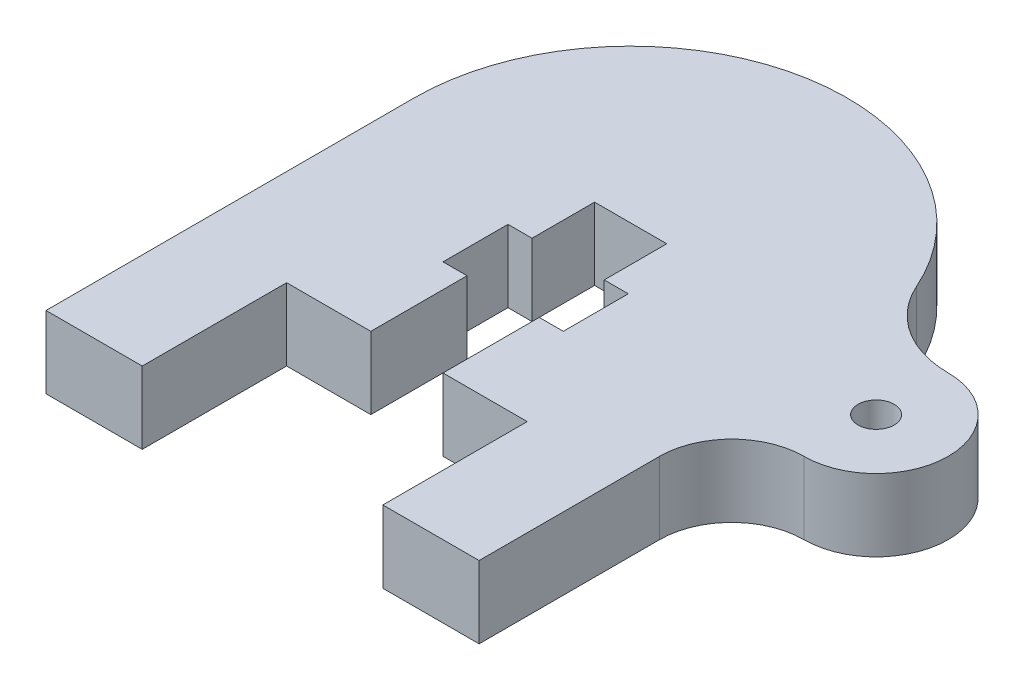
ISO-10303-21;
HEADER;
FILE_DESCRIPTION(('STEP AP214'),'2;1');
FILE_NAME('part.step','',(''),(''),'','','');
FILE_SCHEMA(('AUTOMOTIVE_DESIGN { 1 0 10303 214 1 1 1 1 }'));
ENDSEC;
DATA;
#1=APPLICATION_CONTEXT('core data for automotive mechanical design processes');
#2=APPLICATION_PROTOCOL_DEFINITION('international standard','automotive_design',2000,#1);
#3=PRODUCT_CONTEXT('',#1,'mechanical');
#4=PRODUCT('Part','Part','',(#3));
#5=PRODUCT_RELATED_PRODUCT_CATEGORY('part','',(#4));
#6=PRODUCT_DEFINITION_FORMATION('','',#4);
#7=PRODUCT_DEFINITION_CONTEXT('part definition',#1,'design');
#8=PRODUCT_DEFINITION('design','',#6,#7);
#9=PRODUCT_DEFINITION_SHAPE('','',#8);
#10=(LENGTH_UNIT() NAMED_UNIT(*) SI_UNIT(.MILLI.,.METRE.));
#11=(NAMED_UNIT(*) PLANE_ANGLE_UNIT() SI_UNIT($,.RADIAN.));
#12=(NAMED_UNIT(*) SI_UNIT($,.STERADIAN.) SOLID_ANGLE_UNIT());
#13=UNCERTAINTY_MEASURE_WITH_UNIT(LENGTH_MEASURE(1.E-05),#10,'distance_accuracy_value','');
#14=(GEOMETRIC_REPRESENTATION_CONTEXT(3) GLOBAL_UNCERTAINTY_ASSIGNED_CONTEXT((#13)) GLOBAL_UNIT_ASSIGNED_CONTEXT((#10,
#11,#12)) REPRESENTATION_CONTEXT('',''));
#15=CARTESIAN_POINT('',(0.,0.,0.));
#16=DIRECTION('',(0.,0.,1.));
#17=DIRECTION('',(1.,0.,0.));
#18=AXIS2_PLACEMENT_3D('',#15,#16,#17);
#19=CARTESIAN_POINT('',(-32.3037732077525,3.,-8.18438991730198));
#20=DIRECTION('',(0.,-1.,0.));
#21=DIRECTION('',(0.,0.,-1.));
#22=AXIS2_PLACEMENT_3D('',#19,#20,#21);
#23=PLANE('',#22);
#24=CARTESIAN_POINT('',(-32.3037732077525,3.,-8.18438991730198));
#25=DIRECTION('',(0.,1.,0.));
#26=DIRECTION('',(0.,0.,-1.));
#27=AXIS2_PLACEMENT_3D('',#24,#25,#26);
#28=CIRCLE('',#27,9.00000000000001);
#29=CARTESIAN_POINT('',(-24.0788171444836,3.,-11.8381684761772));
#30=VERTEX_POINT('',#29);
#31=CARTESIAN_POINT('',(-41.3037732077525,3.,-8.18438991730198));
#32=VERTEX_POINT('',#31);
#33=EDGE_CURVE('E272',#30,#32,#28,.T.);
#34=ORIENTED_EDGE('',*,*,#33,.T.);
#35=DIRECTION('',(0.,0.,1.));
#36=VECTOR('',#35,1.);
#37=CARTESIAN_POINT('',(-41.3037732077525,3.,-8.18438991730198));
#38=LINE('',#37,#36);
#39=CARTESIAN_POINT('',(-41.3037732077525,3.,7.11561008269802));
#40=VERTEX_POINT('',#39);
#41=EDGE_CURVE('E148',#32,#40,#38,.T.);
#42=ORIENTED_EDGE('',*,*,#41,.T.);
#43=DIRECTION('',(1.,0.,0.));
#44=VECTOR('',#43,1.);
#45=CARTESIAN_POINT('',(-41.3037732077525,3.,7.11561008269802));
#46=LINE('',#45,#44);
#47=CARTESIAN_POINT('',(-37.3037732077525,3.,7.11561008269802));
#48=VERTEX_POINT('',#47);
#49=EDGE_CURVE('E334',#40,#48,#46,.T.);
#50=ORIENTED_EDGE('',*,*,#49,.T.);
#51=DIRECTION('',(0.,0.,-1.));
#52=VECTOR('',#51,1.);
#53=CARTESIAN_POINT('',(-37.3037732077525,3.,7.11561008269802));
#54=LINE('',#53,#52);
#55=CARTESIAN_POINT('',(-37.3037732077525,3.,1.11561008269802));
#56=VERTEX_POINT('',#55);
#57=EDGE_CURVE('E355',#48,#56,#54,.T.);
#58=ORIENTED_EDGE('',*,*,#57,.T.);
#59=DIRECTION('',(1.,0.,0.));
#60=VECTOR('',#59,1.);
#61=CARTESIAN_POINT('',(-37.3037732077525,3.,1.11561008269802));
#62=LINE('',#61,#60);
#63=CARTESIAN_POINT('',(-33.8037732077525,3.,1.11561008269802));
#64=VERTEX_POINT('',#63);
#65=EDGE_CURVE('E349',#56,#64,#62,.T.);
#66=ORIENTED_EDGE('',*,*,#65,.T.);
#67=DIRECTION('',(0.,0.,-1.));
#68=VECTOR('',#67,1.);
#69=CARTESIAN_POINT('',(-33.8037732077525,3.,1.11561008269802));
#70=LINE('',#69,#68);
#71=CARTESIAN_POINT('',(-33.8037732077525,3.,-2.88438991730198));
#72=VERTEX_POINT('',#71);
#73=EDGE_CURVE('E351',#64,#72,#70,.T.);
#74=ORIENTED_EDGE('',*,*,#73,.T.);
#75=DIRECTION('',(-1.,0.,0.));
#76=VECTOR('',#75,1.);
#77=CARTESIAN_POINT('',(-33.8037732077525,3.,-2.88438991730198));
#78=LINE('',#77,#76);
#79=CARTESIAN_POINT('',(-34.8037732077525,3.,-2.88438991730198));
#80=VERTEX_POINT('',#79);
#81=EDGE_CURVE('E353',#72,#80,#78,.T.);
#82=ORIENTED_EDGE('',*,*,#81,.T.);
#83=DIRECTION('',(0.,0.,-1.));
#84=VECTOR('',#83,1.);
#85=CARTESIAN_POINT('',(-34.8037732077525,3.,-2.88438991730198));
#86=LINE('',#85,#84);
#87=CARTESIAN_POINT('',(-34.8037732077525,3.,-5.58438991730198));
#88=VERTEX_POINT('',#87);
#89=EDGE_CURVE('E358',#80,#88,#86,.T.);
#90=ORIENTED_EDGE('',*,*,#89,.T.);
#91=DIRECTION('',(1.,0.,0.));
#92=VECTOR('',#91,1.);
#93=CARTESIAN_POINT('',(-34.8037732077525,3.,-5.58438991730198));
#94=LINE('',#93,#92);
#95=CARTESIAN_POINT('',(-33.8037732077525,3.,-5.58438991730198));
#96=VERTEX_POINT('',#95);
#97=EDGE_CURVE('E362',#88,#96,#94,.T.);
#98=ORIENTED_EDGE('',*,*,#97,.T.);
#99=DIRECTION('',(0.,0.,-1.));
#100=VECTOR('',#99,1.);
#101=CARTESIAN_POINT('',(-33.8037732077525,3.,-5.58438991730198));
#102=LINE('',#101,#100);
#103=CARTESIAN_POINT('',(-33.8037732077525,3.,-8.18438991730198));
#104=VERTEX_POINT('',#103);
#105=EDGE_CURVE('E365',#96,#104,#102,.T.);
#106=ORIENTED_EDGE('',*,*,#105,.T.);
#107=DIRECTION('',(1.,0.,0.));
#108=VECTOR('',#107,1.);
#109=CARTESIAN_POINT('',(-33.8037732077525,3.,-8.18438991730198));
#110=LINE('',#109,#108);
#111=CARTESIAN_POINT('',(-30.8037732077525,3.,-8.18438991730198));
#112=VERTEX_POINT('',#111);
#113=EDGE_CURVE('E368',#104,#112,#110,.T.);
#114=ORIENTED_EDGE('',*,*,#113,.T.);
#115=DIRECTION('',(0.,0.,1.));
#116=VECTOR('',#115,1.);
#117=CARTESIAN_POINT('',(-30.8037732077525,3.,-5.58438991730198));
#118=LINE('',#117,#116);
#119=CARTESIAN_POINT('',(-30.8037732077525,3.,-5.58438991730198));
#120=VERTEX_POINT('',#119);
#121=EDGE_CURVE('E366',#112,#120,#118,.T.);
#122=ORIENTED_EDGE('',*,*,#121,.T.);
#123=DIRECTION('',(1.,0.,0.));
#124=VECTOR('',#123,1.);
#125=CARTESIAN_POINT('',(-29.8037732077525,3.,-5.58438991730198));
#126=LINE('',#125,#124);
#127=CARTESIAN_POINT('',(-29.8037732077525,3.,-5.58438991730198));
#128=VERTEX_POINT('',#127);
#129=EDGE_CURVE('E367',#120,#128,#126,.T.);
#130=ORIENTED_EDGE('',*,*,#129,.T.);
#131=DIRECTION('',(0.,0.,1.));
#132=VECTOR('',#131,1.);
#133=CARTESIAN_POINT('',(-29.8037732077525,3.,-2.88438991730198));
#134=LINE('',#133,#132);
#135=CARTESIAN_POINT('',(-29.8037732077525,3.,-2.88438991730198));
#136=VERTEX_POINT('',#135);
#137=EDGE_CURVE('E375',#128,#136,#134,.T.);
#138=ORIENTED_EDGE('',*,*,#137,.T.);
#139=DIRECTION('',(-1.,0.,0.));
#140=VECTOR('',#139,1.);
#141=CARTESIAN_POINT('',(-30.8037732077525,3.,-2.88438991730198));
#142=LINE('',#141,#140);
#143=CARTESIAN_POINT('',(-30.8037732077525,3.,-2.88438991730198));
#144=VERTEX_POINT('',#143);
#145=EDGE_CURVE('E372',#136,#144,#142,.T.);
#146=ORIENTED_EDGE('',*,*,#145,.T.);
#147=DIRECTION('',(0.,0.,1.));
#148=VECTOR('',#147,1.);
#149=CARTESIAN_POINT('',(-30.8037732077525,3.,1.11561008269802));
#150=LINE('',#149,#148);
#151=CARTESIAN_POINT('',(-30.8037732077525,3.,1.11561008269802));
#152=VERTEX_POINT('',#151);
#153=EDGE_CURVE('E376',#144,#152,#150,.T.);
#154=ORIENTED_EDGE('',*,*,#153,.T.);
#155=DIRECTION('',(1.,0.,0.));
#156=VECTOR('',#155,1.);
#157=CARTESIAN_POINT('',(-27.3037732077525,3.,1.11561008269802));
#158=LINE('',#157,#156);
#159=CARTESIAN_POINT('',(-27.3037732077525,3.,1.11561008269802));
#160=VERTEX_POINT('',#159);
#161=EDGE_CURVE('E378',#152,#160,#158,.T.);
#162=ORIENTED_EDGE('',*,*,#161,.T.);
#163=DIRECTION('',(0.,0.,1.));
#164=VECTOR('',#163,1.);
#165=CARTESIAN_POINT('',(-27.3037732077525,3.,7.11561008269802));
#166=LINE('',#165,#164);
#167=CARTESIAN_POINT('',(-27.3037732077525,3.,7.11561008269802));
#168=VERTEX_POINT('',#167);
#169=EDGE_CURVE('E379',#160,#168,#166,.T.);
#170=ORIENTED_EDGE('',*,*,#169,.T.);
#171=DIRECTION('',(1.,0.,0.));
#172=VECTOR('',#171,1.);
#173=CARTESIAN_POINT('',(-23.3037732077525,3.,7.11561008269802));
#174=LINE('',#173,#172);
#175=CARTESIAN_POINT('',(-23.3037732077525,3.,7.11561008269802));
#176=VERTEX_POINT('',#175);
#177=EDGE_CURVE('E385',#168,#176,#174,.T.);
#178=ORIENTED_EDGE('',*,*,#177,.T.);
#179=DIRECTION('',(0.,0.,-1.));
#180=VECTOR('',#179,1.);
#181=CARTESIAN_POINT('',(-23.3037732077525,3.,7.11561008269802));
#182=LINE('',#181,#180);
#183=CARTESIAN_POINT('',(-23.3037732077525,3.,-0.384389917301983));
#184=VERTEX_POINT('',#183);
#185=EDGE_CURVE('E209',#176,#184,#182,.T.);
#186=ORIENTED_EDGE('',*,*,#185,.T.);
#187=CARTESIAN_POINT('',(-20.3037732077525,3.,-0.384389917301983));
#188=DIRECTION('',(0.,-1.,0.));
#189=DIRECTION('',(0.,0.,-1.));
#190=AXIS2_PLACEMENT_3D('',#187,#188,#189);
#191=CIRCLE('',#190,3.);
#192=CARTESIAN_POINT('',(-20.3037732077525,3.,-3.38438991730198));
#193=VERTEX_POINT('',#192);
#194=EDGE_CURVE('E204',#184,#193,#191,.T.);
#195=ORIENTED_EDGE('',*,*,#194,.T.);
#196=CARTESIAN_POINT('',(-20.3037732077525,3.,-6.38438991730198));
#197=DIRECTION('',(0.,1.,0.));
#198=DIRECTION('',(0.,0.,1.));
#199=AXIS2_PLACEMENT_3D('',#196,#197,#198);
#200=CIRCLE('',#199,3.);
#201=CARTESIAN_POINT('',(-20.3037732077525,3.,-9.38438991730198));
#202=VERTEX_POINT('',#201);
#203=EDGE_CURVE('E208',#193,#202,#200,.T.);
#204=ORIENTED_EDGE('',*,*,#203,.T.);
#205=CARTESIAN_POINT('',(-20.3037732077525,3.,-13.5151591480713));
#206=DIRECTION('',(0.,-1.,0.));
#207=DIRECTION('',(0.,0.,-1.));
#208=AXIS2_PLACEMENT_3D('',#205,#206,#207);
#209=CIRCLE('',#208,4.13076923076927);
#210=EDGE_CURVE('E59',#202,#30,#209,.T.);
#211=ORIENTED_EDGE('',*,*,#210,.T.);
#212=EDGE_LOOP('',(#34,#42,#50,#58,#66,#74,#82,#90,#98,#106,#114,#122,#130,#138,#146,#154,#162,
#170,#178,#186,#195,#204,#211));
#213=FACE_BOUND('',#212,.T.);
#214=CARTESIAN_POINT('',(-20.3037732077525,3.,-6.38438991730198));
#215=DIRECTION('',(0.,1.,0.));
#216=DIRECTION('',(0.,0.,1.));
#217=AXIS2_PLACEMENT_3D('',#214,#215,#216);
#218=CIRCLE('',#217,0.750000000000002);
#219=CARTESIAN_POINT('',(-20.3037732077525,3.,-5.63438991730198));
#220=VERTEX_POINT('',#219);
#221=EDGE_CURVE('E234',#220,#220,#218,.T.);
#222=ORIENTED_EDGE('',*,*,#221,.F.);
#223=EDGE_LOOP('',(#222));
#224=FACE_BOUND('',#223,.T.);
#225=ADVANCED_FACE('F41',(#213,#224),#23,.F.);
#226=CARTESIAN_POINT('',(-32.3037732077525,0.,-8.18438991730198));
#227=DIRECTION('',(0.,-1.,0.));
#228=DIRECTION('',(0.,0.,-1.));
#229=AXIS2_PLACEMENT_3D('',#226,#227,#228);
#230=PLANE('',#229);
#231=CARTESIAN_POINT('',(-32.3037732077525,0.,-8.18438991730198));
#232=DIRECTION('',(0.,1.,0.));
#233=DIRECTION('',(0.,0.,-1.));
#234=AXIS2_PLACEMENT_3D('',#231,#232,#233);
#235=CIRCLE('',#234,9.00000000000001);
#236=CARTESIAN_POINT('',(-24.0788171444836,0.,-11.8381684761772));
#237=VERTEX_POINT('',#236);
#238=CARTESIAN_POINT('',(-41.3037732077525,0.,-8.18438991730198));
#239=VERTEX_POINT('',#238);
#240=EDGE_CURVE('E227',#237,#239,#235,.T.);
#241=ORIENTED_EDGE('',*,*,#240,.F.);
#242=CARTESIAN_POINT('',(-20.3037732077525,0.,-13.5151591480713));
#243=DIRECTION('',(0.,-1.,0.));
#244=DIRECTION('',(0.,0.,-1.));
#245=AXIS2_PLACEMENT_3D('',#242,#243,#244);
#246=CIRCLE('',#245,4.13076923076927);
#247=CARTESIAN_POINT('',(-20.3037732077525,0.,-9.38438991730198));
#248=VERTEX_POINT('',#247);
#249=EDGE_CURVE('E140',#248,#237,#246,.T.);
#250=ORIENTED_EDGE('',*,*,#249,.F.);
#251=CARTESIAN_POINT('',(-20.3037732077525,0.,-6.38438991730198));
#252=DIRECTION('',(0.,1.,0.));
#253=DIRECTION('',(0.,0.,1.));
#254=AXIS2_PLACEMENT_3D('',#251,#252,#253);
#255=CIRCLE('',#254,3.);
#256=CARTESIAN_POINT('',(-20.3037732077525,0.,-3.38438991730198));
#257=VERTEX_POINT('',#256);
#258=EDGE_CURVE('E135',#257,#248,#255,.T.);
#259=ORIENTED_EDGE('',*,*,#258,.F.);
#260=CARTESIAN_POINT('',(-20.3037732077525,0.,-0.384389917301983));
#261=DIRECTION('',(0.,-1.,0.));
#262=DIRECTION('',(0.,0.,-1.));
#263=AXIS2_PLACEMENT_3D('',#260,#261,#262);
#264=CIRCLE('',#263,3.);
#265=CARTESIAN_POINT('',(-23.3037732077525,0.,-0.384389917301983));
#266=VERTEX_POINT('',#265);
#267=EDGE_CURVE('E217',#266,#257,#264,.T.);
#268=ORIENTED_EDGE('',*,*,#267,.F.);
#269=DIRECTION('',(0.,0.,-1.));
#270=VECTOR('',#269,1.);
#271=CARTESIAN_POINT('',(-23.3037732077525,0.,7.11561008269802));
#272=LINE('',#271,#270);
#273=CARTESIAN_POINT('',(-23.3037732077525,0.,7.11561008269802));
#274=VERTEX_POINT('',#273);
#275=EDGE_CURVE('E268',#274,#266,#272,.T.);
#276=ORIENTED_EDGE('',*,*,#275,.F.);
#277=DIRECTION('',(1.,0.,0.));
#278=VECTOR('',#277,1.);
#279=CARTESIAN_POINT('',(-23.3037732077525,0.,7.11561008269802));
#280=LINE('',#279,#278);
#281=CARTESIAN_POINT('',(-27.3037732077525,0.,7.11561008269802));
#282=VERTEX_POINT('',#281);
#283=EDGE_CURVE('E266',#282,#274,#280,.T.);
#284=ORIENTED_EDGE('',*,*,#283,.F.);
#285=DIRECTION('',(0.,0.,1.));
#286=VECTOR('',#285,1.);
#287=CARTESIAN_POINT('',(-27.3037732077525,0.,7.11561008269802));
#288=LINE('',#287,#286);
#289=CARTESIAN_POINT('',(-27.3037732077525,0.,1.11561008269802));
#290=VERTEX_POINT('',#289);
#291=EDGE_CURVE('E262',#290,#282,#288,.T.);
#292=ORIENTED_EDGE('',*,*,#291,.F.);
#293=DIRECTION('',(1.,0.,0.));
#294=VECTOR('',#293,1.);
#295=CARTESIAN_POINT('',(-27.3037732077525,0.,1.11561008269802));
#296=LINE('',#295,#294);
#297=CARTESIAN_POINT('',(-30.8037732077525,0.,1.11561008269802));
#298=VERTEX_POINT('',#297);
#299=EDGE_CURVE('E265',#298,#290,#296,.T.);
#300=ORIENTED_EDGE('',*,*,#299,.F.);
#301=DIRECTION('',(0.,0.,1.));
#302=VECTOR('',#301,1.);
#303=CARTESIAN_POINT('',(-30.8037732077525,0.,1.11561008269802));
#304=LINE('',#303,#302);
#305=CARTESIAN_POINT('',(-30.8037732077525,0.,-2.88438991730198));
#306=VERTEX_POINT('',#305);
#307=EDGE_CURVE('E257',#306,#298,#304,.T.);
#308=ORIENTED_EDGE('',*,*,#307,.F.);
#309=DIRECTION('',(-1.,0.,0.));
#310=VECTOR('',#309,1.);
#311=CARTESIAN_POINT('',(-30.8037732077525,0.,-2.88438991730198));
#312=LINE('',#311,#310);
#313=CARTESIAN_POINT('',(-29.8037732077525,0.,-2.88438991730198));
#314=VERTEX_POINT('',#313);
#315=EDGE_CURVE('E256',#314,#306,#312,.T.);
#316=ORIENTED_EDGE('',*,*,#315,.F.);
#317=DIRECTION('',(0.,0.,1.));
#318=VECTOR('',#317,1.);
#319=CARTESIAN_POINT('',(-29.8037732077525,0.,-2.88438991730198));
#320=LINE('',#319,#318);
#321=CARTESIAN_POINT('',(-29.8037732077525,0.,-5.58438991730198));
#322=VERTEX_POINT('',#321);
#323=EDGE_CURVE('E258',#322,#314,#320,.T.);
#324=ORIENTED_EDGE('',*,*,#323,.F.);
#325=DIRECTION('',(1.,0.,0.));
#326=VECTOR('',#325,1.);
#327=CARTESIAN_POINT('',(-29.8037732077525,0.,-5.58438991730198));
#328=LINE('',#327,#326);
#329=CARTESIAN_POINT('',(-30.8037732077525,0.,-5.58438991730198));
#330=VERTEX_POINT('',#329);
#331=EDGE_CURVE('E255',#330,#322,#328,.T.);
#332=ORIENTED_EDGE('',*,*,#331,.F.);
#333=DIRECTION('',(0.,0.,1.));
#334=VECTOR('',#333,1.);
#335=CARTESIAN_POINT('',(-30.8037732077525,0.,-5.58438991730198));
#336=LINE('',#335,#334);
#337=CARTESIAN_POINT('',(-30.8037732077525,0.,-8.18438991730198));
#338=VERTEX_POINT('',#337);
#339=EDGE_CURVE('E252',#338,#330,#336,.T.);
#340=ORIENTED_EDGE('',*,*,#339,.F.);
#341=DIRECTION('',(1.,0.,0.));
#342=VECTOR('',#341,1.);
#343=CARTESIAN_POINT('',(-33.8037732077525,0.,-8.18438991730198));
#344=LINE('',#343,#342);
#345=CARTESIAN_POINT('',(-33.8037732077525,0.,-8.18438991730198));
#346=VERTEX_POINT('',#345);
#347=EDGE_CURVE('E248',#346,#338,#344,.T.);
#348=ORIENTED_EDGE('',*,*,#347,.F.);
#349=DIRECTION('',(0.,0.,-1.));
#350=VECTOR('',#349,1.);
#351=CARTESIAN_POINT('',(-33.8037732077525,0.,-5.58438991730198));
#352=LINE('',#351,#350);
#353=CARTESIAN_POINT('',(-33.8037732077525,0.,-5.58438991730198));
#354=VERTEX_POINT('',#353);
#355=EDGE_CURVE('E250',#354,#346,#352,.T.);
#356=ORIENTED_EDGE('',*,*,#355,.F.);
#357=DIRECTION('',(1.,0.,0.));
#358=VECTOR('',#357,1.);
#359=CARTESIAN_POINT('',(-34.8037732077525,0.,-5.58438991730198));
#360=LINE('',#359,#358);
#361=CARTESIAN_POINT('',(-34.8037732077525,0.,-5.58438991730198));
#362=VERTEX_POINT('',#361);
#363=EDGE_CURVE('E247',#362,#354,#360,.T.);
#364=ORIENTED_EDGE('',*,*,#363,.F.);
#365=DIRECTION('',(0.,0.,-1.));
#366=VECTOR('',#365,1.);
#367=CARTESIAN_POINT('',(-34.8037732077525,0.,-2.88438991730198));
#368=LINE('',#367,#366);
#369=CARTESIAN_POINT('',(-34.8037732077525,0.,-2.88438991730198));
#370=VERTEX_POINT('',#369);
#371=EDGE_CURVE('E243',#370,#362,#368,.T.);
#372=ORIENTED_EDGE('',*,*,#371,.F.);
#373=DIRECTION('',(-1.,0.,0.));
#374=VECTOR('',#373,1.);
#375=CARTESIAN_POINT('',(-33.8037732077525,0.,-2.88438991730198));
#376=LINE('',#375,#374);
#377=CARTESIAN_POINT('',(-33.8037732077525,0.,-2.88438991730198));
#378=VERTEX_POINT('',#377);
#379=EDGE_CURVE('E245',#378,#370,#376,.T.);
#380=ORIENTED_EDGE('',*,*,#379,.F.);
#381=DIRECTION('',(0.,0.,-1.));
#382=VECTOR('',#381,1.);
#383=CARTESIAN_POINT('',(-33.8037732077525,0.,1.11561008269802));
#384=LINE('',#383,#382);
#385=CARTESIAN_POINT('',(-33.8037732077525,0.,1.11561008269802));
#386=VERTEX_POINT('',#385);
#387=EDGE_CURVE('E238',#386,#378,#384,.T.);
#388=ORIENTED_EDGE('',*,*,#387,.F.);
#389=DIRECTION('',(1.,0.,0.));
#390=VECTOR('',#389,1.);
#391=CARTESIAN_POINT('',(-37.3037732077525,0.,1.11561008269802));
#392=LINE('',#391,#390);
#393=CARTESIAN_POINT('',(-37.3037732077525,0.,1.11561008269802));
#394=VERTEX_POINT('',#393);
#395=EDGE_CURVE('E236',#394,#386,#392,.T.);
#396=ORIENTED_EDGE('',*,*,#395,.F.);
#397=DIRECTION('',(0.,0.,-1.));
#398=VECTOR('',#397,1.);
#399=CARTESIAN_POINT('',(-37.3037732077525,0.,7.11561008269802));
#400=LINE('',#399,#398);
#401=CARTESIAN_POINT('',(-37.3037732077525,0.,7.11561008269802));
#402=VERTEX_POINT('',#401);
#403=EDGE_CURVE('E237',#402,#394,#400,.T.);
#404=ORIENTED_EDGE('',*,*,#403,.F.);
#405=DIRECTION('',(1.,0.,0.));
#406=VECTOR('',#405,1.);
#407=CARTESIAN_POINT('',(-41.3037732077525,0.,7.11561008269802));
#408=LINE('',#407,#406);
#409=CARTESIAN_POINT('',(-41.3037732077525,0.,7.11561008269802));
#410=VERTEX_POINT('',#409);
#411=EDGE_CURVE('E231',#410,#402,#408,.T.);
#412=ORIENTED_EDGE('',*,*,#411,.F.);
#413=DIRECTION('',(0.,0.,1.));
#414=VECTOR('',#413,1.);
#415=CARTESIAN_POINT('',(-41.3037732077525,0.,-8.18438991730198));
#416=LINE('',#415,#414);
#417=EDGE_CURVE('E232',#239,#410,#416,.T.);
#418=ORIENTED_EDGE('',*,*,#417,.F.);
#419=EDGE_LOOP('',(#241,#250,#259,#268,#276,#284,#292,#300,#308,#316,#324,#332,#340,#348,#356,
#364,#372,#380,#388,#396,#404,#412,#418));
#420=FACE_BOUND('',#419,.T.);
#421=CARTESIAN_POINT('',(-20.3037732077525,0.,-6.38438991730198));
#422=DIRECTION('',(0.,1.,0.));
#423=DIRECTION('',(0.,0.,1.));
#424=AXIS2_PLACEMENT_3D('',#421,#422,#423);
#425=CIRCLE('',#424,0.750000000000002);
#426=CARTESIAN_POINT('',(-20.3037732077525,0.,-5.63438991730198));
#427=VERTEX_POINT('',#426);
#428=EDGE_CURVE('E674',#427,#427,#425,.T.);
#429=ORIENTED_EDGE('',*,*,#428,.T.);
#430=EDGE_LOOP('',(#429));
#431=FACE_BOUND('',#430,.T.);
#432=ADVANCED_FACE('F340',(#420,#431),#230,.T.);
#433=CARTESIAN_POINT('',(-32.3037732077525,3.,-8.18438991730198));
#434=DIRECTION('',(0.,-1.,0.));
#435=DIRECTION('',(0.,0.,-1.));
#436=AXIS2_PLACEMENT_3D('',#433,#434,#435);
#437=CYLINDRICAL_SURFACE('',#436,9.00000000000001);
#438=ORIENTED_EDGE('',*,*,#240,.T.);
#439=DIRECTION('',(0.,-1.,0.));
#440=VECTOR('',#439,1.);
#441=CARTESIAN_POINT('',(-41.3037732077525,3.,-8.18438991730198));
#442=LINE('',#441,#440);
#443=EDGE_CURVE('E11',#32,#239,#442,.T.);
#444=ORIENTED_EDGE('',*,*,#443,.F.);
#445=ORIENTED_EDGE('',*,*,#33,.F.);
#446=DIRECTION('',(0.,-1.,0.));
#447=VECTOR('',#446,1.);
#448=CARTESIAN_POINT('',(-24.0788171444836,3.,-11.8381684761772));
#449=LINE('',#448,#447);
#450=EDGE_CURVE('E221',#30,#237,#449,.T.);
#451=ORIENTED_EDGE('',*,*,#450,.T.);
#452=EDGE_LOOP('',(#438,#444,#445,#451));
#453=FACE_BOUND('',#452,.T.);
#454=ADVANCED_FACE('F43',(#453),#437,.T.);
#455=CARTESIAN_POINT('',(-41.3037732077525,3.,-8.18438991730198));
#456=DIRECTION('',(1.,0.,0.));
#457=DIRECTION('',(0.,0.,-1.));
#458=AXIS2_PLACEMENT_3D('',#455,#456,#457);
#459=PLANE('',#458);
#460=ORIENTED_EDGE('',*,*,#417,.T.);
#461=DIRECTION('',(0.,-1.,0.));
#462=VECTOR('',#461,1.);
#463=CARTESIAN_POINT('',(-41.3037732077525,3.,7.11561008269802));
#464=LINE('',#463,#462);
#465=EDGE_CURVE('E49',#40,#410,#464,.T.);
#466=ORIENTED_EDGE('',*,*,#465,.F.);
#467=ORIENTED_EDGE('',*,*,#41,.F.);
#468=ORIENTED_EDGE('',*,*,#443,.T.);
#469=EDGE_LOOP('',(#460,#466,#467,#468));
#470=FACE_BOUND('',#469,.T.);
#471=ADVANCED_FACE('F418',(#470),#459,.F.);
#472=CARTESIAN_POINT('',(-41.3037732077525,3.,7.11561008269802));
#473=DIRECTION('',(0.,0.,-1.));
#474=DIRECTION('',(-1.,0.,0.));
#475=AXIS2_PLACEMENT_3D('',#472,#473,#474);
#476=PLANE('',#475);
#477=ORIENTED_EDGE('',*,*,#411,.T.);
#478=DIRECTION('',(0.,-1.,0.));
#479=VECTOR('',#478,1.);
#480=CARTESIAN_POINT('',(-37.3037732077525,3.,7.11561008269802));
#481=LINE('',#480,#479);
#482=EDGE_CURVE('E324',#48,#402,#481,.T.);
#483=ORIENTED_EDGE('',*,*,#482,.F.);
#484=ORIENTED_EDGE('',*,*,#49,.F.);
#485=ORIENTED_EDGE('',*,*,#465,.T.);
#486=EDGE_LOOP('',(#477,#483,#484,#485));
#487=FACE_BOUND('',#486,.T.);
#488=ADVANCED_FACE('F332',(#487),#476,.F.);
#489=CARTESIAN_POINT('',(-37.3037732077525,3.,7.11561008269802));
#490=DIRECTION('',(-1.,0.,0.));
#491=DIRECTION('',(0.,0.,1.));
#492=AXIS2_PLACEMENT_3D('',#489,#490,#491);
#493=PLANE('',#492);
#494=ORIENTED_EDGE('',*,*,#403,.T.);
#495=DIRECTION('',(0.,-1.,0.));
#496=VECTOR('',#495,1.);
#497=CARTESIAN_POINT('',(-37.3037732077525,3.,1.11561008269802));
#498=LINE('',#497,#496);
#499=EDGE_CURVE('E325',#56,#394,#498,.T.);
#500=ORIENTED_EDGE('',*,*,#499,.F.);
#501=ORIENTED_EDGE('',*,*,#57,.F.);
#502=ORIENTED_EDGE('',*,*,#482,.T.);
#503=EDGE_LOOP('',(#494,#500,#501,#502));
#504=FACE_BOUND('',#503,.T.);
#505=ADVANCED_FACE('F345',(#504),#493,.F.);
#506=CARTESIAN_POINT('',(-37.3037732077525,3.,1.11561008269802));
#507=DIRECTION('',(0.,0.,-1.));
#508=DIRECTION('',(-1.,0.,0.));
#509=AXIS2_PLACEMENT_3D('',#506,#507,#508);
#510=PLANE('',#509);
#511=ORIENTED_EDGE('',*,*,#395,.T.);
#512=DIRECTION('',(0.,-1.,0.));
#513=VECTOR('',#512,1.);
#514=CARTESIAN_POINT('',(-33.8037732077525,3.,1.11561008269802));
#515=LINE('',#514,#513);
#516=EDGE_CURVE('E317',#64,#386,#515,.T.);
#517=ORIENTED_EDGE('',*,*,#516,.F.);
#518=ORIENTED_EDGE('',*,*,#65,.F.);
#519=ORIENTED_EDGE('',*,*,#499,.T.);
#520=EDGE_LOOP('',(#511,#517,#518,#519));
#521=FACE_BOUND('',#520,.T.);
#522=ADVANCED_FACE('F350',(#521),#510,.F.);
#523=CARTESIAN_POINT('',(-33.8037732077525,3.,1.11561008269802));
#524=DIRECTION('',(-1.,0.,0.));
#525=DIRECTION('',(0.,0.,1.));
#526=AXIS2_PLACEMENT_3D('',#523,#524,#525);
#527=PLANE('',#526);
#528=ORIENTED_EDGE('',*,*,#387,.T.);
#529=DIRECTION('',(0.,-1.,0.));
#530=VECTOR('',#529,1.);
#531=CARTESIAN_POINT('',(-33.8037732077525,3.,-2.88438991730198));
#532=LINE('',#531,#530);
#533=EDGE_CURVE('E316',#72,#378,#532,.T.);
#534=ORIENTED_EDGE('',*,*,#533,.F.);
#535=ORIENTED_EDGE('',*,*,#73,.F.);
#536=ORIENTED_EDGE('',*,*,#516,.T.);
#537=EDGE_LOOP('',(#528,#534,#535,#536));
#538=FACE_BOUND('',#537,.T.);
#539=ADVANCED_FACE('F427',(#538),#527,.F.);
#540=CARTESIAN_POINT('',(-33.8037732077525,3.,-2.88438991730198));
#541=DIRECTION('',(0.,0.,1.));
#542=DIRECTION('',(1.,0.,0.));
#543=AXIS2_PLACEMENT_3D('',#540,#541,#542);
#544=PLANE('',#543);
#545=ORIENTED_EDGE('',*,*,#379,.T.);
#546=DIRECTION('',(0.,-1.,0.));
#547=VECTOR('',#546,1.);
#548=CARTESIAN_POINT('',(-34.8037732077525,3.,-2.88438991730198));
#549=LINE('',#548,#547);
#550=EDGE_CURVE('E311',#80,#370,#549,.T.);
#551=ORIENTED_EDGE('',*,*,#550,.F.);
#552=ORIENTED_EDGE('',*,*,#81,.F.);
#553=ORIENTED_EDGE('',*,*,#533,.T.);
#554=EDGE_LOOP('',(#545,#551,#552,#553));
#555=FACE_BOUND('',#554,.T.);
#556=ADVANCED_FACE('F435',(#555),#544,.F.);
#557=CARTESIAN_POINT('',(-34.8037732077525,3.,-2.88438991730198));
#558=DIRECTION('',(-1.,0.,0.));
#559=DIRECTION('',(0.,0.,1.));
#560=AXIS2_PLACEMENT_3D('',#557,#558,#559);
#561=PLANE('',#560);
#562=ORIENTED_EDGE('',*,*,#371,.T.);
#563=DIRECTION('',(0.,-1.,0.));
#564=VECTOR('',#563,1.);
#565=CARTESIAN_POINT('',(-34.8037732077525,3.,-5.58438991730198));
#566=LINE('',#565,#564);
#567=EDGE_CURVE('E309',#88,#362,#566,.T.);
#568=ORIENTED_EDGE('',*,*,#567,.F.);
#569=ORIENTED_EDGE('',*,*,#89,.F.);
#570=ORIENTED_EDGE('',*,*,#550,.T.);
#571=EDGE_LOOP('',(#562,#568,#569,#570));
#572=FACE_BOUND('',#571,.T.);
#573=ADVANCED_FACE('F436',(#572),#561,.F.);
#574=CARTESIAN_POINT('',(-34.8037732077525,3.,-5.58438991730198));
#575=DIRECTION('',(0.,0.,-1.));
#576=DIRECTION('',(-1.,0.,0.));
#577=AXIS2_PLACEMENT_3D('',#574,#575,#576);
#578=PLANE('',#577);
#579=ORIENTED_EDGE('',*,*,#363,.T.);
#580=DIRECTION('',(0.,-1.,0.));
#581=VECTOR('',#580,1.);
#582=CARTESIAN_POINT('',(-33.8037732077525,3.,-5.58438991730198));
#583=LINE('',#582,#581);
#584=EDGE_CURVE('E307',#96,#354,#583,.T.);
#585=ORIENTED_EDGE('',*,*,#584,.F.);
#586=ORIENTED_EDGE('',*,*,#97,.F.);
#587=ORIENTED_EDGE('',*,*,#567,.T.);
#588=EDGE_LOOP('',(#579,#585,#586,#587));
#589=FACE_BOUND('',#588,.T.);
#590=ADVANCED_FACE('F439',(#589),#578,.F.);
#591=CARTESIAN_POINT('',(-33.8037732077525,3.,-5.58438991730198));
#592=DIRECTION('',(-1.,0.,0.));
#593=DIRECTION('',(0.,0.,1.));
#594=AXIS2_PLACEMENT_3D('',#591,#592,#593);
#595=PLANE('',#594);
#596=ORIENTED_EDGE('',*,*,#355,.T.);
#597=DIRECTION('',(0.,-1.,0.));
#598=VECTOR('',#597,1.);
#599=CARTESIAN_POINT('',(-33.8037732077525,3.,-8.18438991730198));
#600=LINE('',#599,#598);
#601=EDGE_CURVE('E301',#104,#346,#600,.T.);
#602=ORIENTED_EDGE('',*,*,#601,.F.);
#603=ORIENTED_EDGE('',*,*,#105,.F.);
#604=ORIENTED_EDGE('',*,*,#584,.T.);
#605=EDGE_LOOP('',(#596,#602,#603,#604));
#606=FACE_BOUND('',#605,.T.);
#607=ADVANCED_FACE('F441',(#606),#595,.F.);
#608=CARTESIAN_POINT('',(-33.8037732077525,3.,-8.18438991730198));
#609=DIRECTION('',(0.,0.,-1.));
#610=DIRECTION('',(-1.,0.,0.));
#611=AXIS2_PLACEMENT_3D('',#608,#609,#610);
#612=PLANE('',#611);
#613=ORIENTED_EDGE('',*,*,#347,.T.);
#614=DIRECTION('',(0.,-1.,0.));
#615=VECTOR('',#614,1.);
#616=CARTESIAN_POINT('',(-30.8037732077525,3.,-8.18438991730198));
#617=LINE('',#616,#615);
#618=EDGE_CURVE('E302',#112,#338,#617,.T.);
#619=ORIENTED_EDGE('',*,*,#618,.F.);
#620=ORIENTED_EDGE('',*,*,#113,.F.);
#621=ORIENTED_EDGE('',*,*,#601,.T.);
#622=EDGE_LOOP('',(#613,#619,#620,#621));
#623=FACE_BOUND('',#622,.T.);
#624=ADVANCED_FACE('F447',(#623),#612,.F.);
#625=CARTESIAN_POINT('',(-30.8037732077525,3.,-5.58438991730198));
#626=DIRECTION('',(1.,0.,0.));
#627=DIRECTION('',(0.,0.,-1.));
#628=AXIS2_PLACEMENT_3D('',#625,#626,#627);
#629=PLANE('',#628);
#630=ORIENTED_EDGE('',*,*,#339,.T.);
#631=DIRECTION('',(0.,-1.,0.));
#632=VECTOR('',#631,1.);
#633=CARTESIAN_POINT('',(-30.8037732077525,3.,-5.58438991730198));
#634=LINE('',#633,#632);
#635=EDGE_CURVE('E297',#120,#330,#634,.T.);
#636=ORIENTED_EDGE('',*,*,#635,.F.);
#637=ORIENTED_EDGE('',*,*,#121,.F.);
#638=ORIENTED_EDGE('',*,*,#618,.T.);
#639=EDGE_LOOP('',(#630,#636,#637,#638));
#640=FACE_BOUND('',#639,.T.);
#641=ADVANCED_FACE('F454',(#640),#629,.F.);
#642=CARTESIAN_POINT('',(-29.8037732077525,3.,-5.58438991730198));
#643=DIRECTION('',(0.,0.,-1.));
#644=DIRECTION('',(-1.,0.,0.));
#645=AXIS2_PLACEMENT_3D('',#642,#643,#644);
#646=PLANE('',#645);
#647=ORIENTED_EDGE('',*,*,#331,.T.);
#648=DIRECTION('',(0.,-1.,0.));
#649=VECTOR('',#648,1.);
#650=CARTESIAN_POINT('',(-29.8037732077525,3.,-5.58438991730198));
#651=LINE('',#650,#649);
#652=EDGE_CURVE('E293',#128,#322,#651,.T.);
#653=ORIENTED_EDGE('',*,*,#652,.F.);
#654=ORIENTED_EDGE('',*,*,#129,.F.);
#655=ORIENTED_EDGE('',*,*,#635,.T.);
#656=EDGE_LOOP('',(#647,#653,#654,#655));
#657=FACE_BOUND('',#656,.T.);
#658=ADVANCED_FACE('F457',(#657),#646,.F.);
#659=CARTESIAN_POINT('',(-29.8037732077525,3.,-2.88438991730198));
#660=DIRECTION('',(1.,0.,0.));
#661=DIRECTION('',(0.,0.,-1.));
#662=AXIS2_PLACEMENT_3D('',#659,#660,#661);
#663=PLANE('',#662);
#664=ORIENTED_EDGE('',*,*,#323,.T.);
#665=DIRECTION('',(0.,-1.,0.));
#666=VECTOR('',#665,1.);
#667=CARTESIAN_POINT('',(-29.8037732077525,3.,-2.88438991730198));
#668=LINE('',#667,#666);
#669=EDGE_CURVE('E295',#136,#314,#668,.T.);
#670=ORIENTED_EDGE('',*,*,#669,.F.);
#671=ORIENTED_EDGE('',*,*,#137,.F.);
#672=ORIENTED_EDGE('',*,*,#652,.T.);
#673=EDGE_LOOP('',(#664,#670,#671,#672));
#674=FACE_BOUND('',#673,.T.);
#675=ADVANCED_FACE('F458',(#674),#663,.F.);
#676=CARTESIAN_POINT('',(-30.8037732077525,3.,-2.88438991730198));
#677=DIRECTION('',(0.,0.,1.));
#678=DIRECTION('',(1.,0.,0.));
#679=AXIS2_PLACEMENT_3D('',#676,#677,#678);
#680=PLANE('',#679);
#681=ORIENTED_EDGE('',*,*,#315,.T.);
#682=DIRECTION('',(0.,-1.,0.));
#683=VECTOR('',#682,1.);
#684=CARTESIAN_POINT('',(-30.8037732077525,3.,-2.88438991730198));
#685=LINE('',#684,#683);
#686=EDGE_CURVE('E286',#144,#306,#685,.T.);
#687=ORIENTED_EDGE('',*,*,#686,.F.);
#688=ORIENTED_EDGE('',*,*,#145,.F.);
#689=ORIENTED_EDGE('',*,*,#669,.T.);
#690=EDGE_LOOP('',(#681,#687,#688,#689));
#691=FACE_BOUND('',#690,.T.);
#692=ADVANCED_FACE('F463',(#691),#680,.F.);
#693=CARTESIAN_POINT('',(-30.8037732077525,3.,1.11561008269802));
#694=DIRECTION('',(1.,0.,0.));
#695=DIRECTION('',(0.,0.,-1.));
#696=AXIS2_PLACEMENT_3D('',#693,#694,#695);
#697=PLANE('',#696);
#698=ORIENTED_EDGE('',*,*,#307,.T.);
#699=DIRECTION('',(0.,-1.,0.));
#700=VECTOR('',#699,1.);
#701=CARTESIAN_POINT('',(-30.8037732077525,3.,1.11561008269802));
#702=LINE('',#701,#700);
#703=EDGE_CURVE('E287',#152,#298,#702,.T.);
#704=ORIENTED_EDGE('',*,*,#703,.F.);
#705=ORIENTED_EDGE('',*,*,#153,.F.);
#706=ORIENTED_EDGE('',*,*,#686,.T.);
#707=EDGE_LOOP('',(#698,#704,#705,#706));
#708=FACE_BOUND('',#707,.T.);
#709=ADVANCED_FACE('F470',(#708),#697,.F.);
#710=CARTESIAN_POINT('',(-27.3037732077525,3.,1.11561008269802));
#711=DIRECTION('',(0.,0.,-1.));
#712=DIRECTION('',(-1.,0.,0.));
#713=AXIS2_PLACEMENT_3D('',#710,#711,#712);
#714=PLANE('',#713);
#715=ORIENTED_EDGE('',*,*,#299,.T.);
#716=DIRECTION('',(0.,-1.,0.));
#717=VECTOR('',#716,1.);
#718=CARTESIAN_POINT('',(-27.3037732077525,3.,1.11561008269802));
#719=LINE('',#718,#717);
#720=EDGE_CURVE('E282',#160,#290,#719,.T.);
#721=ORIENTED_EDGE('',*,*,#720,.F.);
#722=ORIENTED_EDGE('',*,*,#161,.F.);
#723=ORIENTED_EDGE('',*,*,#703,.T.);
#724=EDGE_LOOP('',(#715,#721,#722,#723));
#725=FACE_BOUND('',#724,.T.);
#726=ADVANCED_FACE('F472',(#725),#714,.F.);
#727=CARTESIAN_POINT('',(-27.3037732077525,3.,7.11561008269802));
#728=DIRECTION('',(1.,0.,0.));
#729=DIRECTION('',(0.,0.,-1.));
#730=AXIS2_PLACEMENT_3D('',#727,#728,#729);
#731=PLANE('',#730);
#732=ORIENTED_EDGE('',*,*,#291,.T.);
#733=DIRECTION('',(0.,-1.,0.));
#734=VECTOR('',#733,1.);
#735=CARTESIAN_POINT('',(-27.3037732077525,3.,7.11561008269802));
#736=LINE('',#735,#734);
#737=EDGE_CURVE('E278',#168,#282,#736,.T.);
#738=ORIENTED_EDGE('',*,*,#737,.F.);
#739=ORIENTED_EDGE('',*,*,#169,.F.);
#740=ORIENTED_EDGE('',*,*,#720,.T.);
#741=EDGE_LOOP('',(#732,#738,#739,#740));
#742=FACE_BOUND('',#741,.T.);
#743=ADVANCED_FACE('F478',(#742),#731,.F.);
#744=CARTESIAN_POINT('',(-23.3037732077525,3.,7.11561008269802));
#745=DIRECTION('',(0.,0.,-1.));
#746=DIRECTION('',(-1.,0.,0.));
#747=AXIS2_PLACEMENT_3D('',#744,#745,#746);
#748=PLANE('',#747);
#749=ORIENTED_EDGE('',*,*,#283,.T.);
#750=DIRECTION('',(0.,-1.,0.));
#751=VECTOR('',#750,1.);
#752=CARTESIAN_POINT('',(-23.3037732077525,3.,7.11561008269802));
#753=LINE('',#752,#751);
#754=EDGE_CURVE('E280',#176,#274,#753,.T.);
#755=ORIENTED_EDGE('',*,*,#754,.F.);
#756=ORIENTED_EDGE('',*,*,#177,.F.);
#757=ORIENTED_EDGE('',*,*,#737,.T.);
#758=EDGE_LOOP('',(#749,#755,#756,#757));
#759=FACE_BOUND('',#758,.T.);
#760=ADVANCED_FACE('F389',(#759),#748,.F.);
#761=CARTESIAN_POINT('',(-23.3037732077525,3.,7.11561008269802));
#762=DIRECTION('',(-1.,0.,0.));
#763=DIRECTION('',(0.,0.,1.));
#764=AXIS2_PLACEMENT_3D('',#761,#762,#763);
#765=PLANE('',#764);
#766=ORIENTED_EDGE('',*,*,#275,.T.);
#767=DIRECTION('',(0.,-1.,0.));
#768=VECTOR('',#767,1.);
#769=CARTESIAN_POINT('',(-23.3037732077525,3.,-0.384389917301983));
#770=LINE('',#769,#768);
#771=EDGE_CURVE('E218',#184,#266,#770,.T.);
#772=ORIENTED_EDGE('',*,*,#771,.F.);
#773=ORIENTED_EDGE('',*,*,#185,.F.);
#774=ORIENTED_EDGE('',*,*,#754,.T.);
#775=EDGE_LOOP('',(#766,#772,#773,#774));
#776=FACE_BOUND('',#775,.T.);
#777=ADVANCED_FACE('F395',(#776),#765,.F.);
#778=CARTESIAN_POINT('',(-20.3037732077525,3.,-0.384389917301983));
#779=DIRECTION('',(0.,-1.,0.));
#780=DIRECTION('',(0.,0.,-1.));
#781=AXIS2_PLACEMENT_3D('',#778,#779,#780);
#782=CYLINDRICAL_SURFACE('',#781,3.);
#783=ORIENTED_EDGE('',*,*,#267,.T.);
#784=DIRECTION('',(0.,-1.,0.));
#785=VECTOR('',#784,1.);
#786=CARTESIAN_POINT('',(-20.3037732077525,3.,-3.38438991730198));
#787=LINE('',#786,#785);
#788=EDGE_CURVE('E214',#193,#257,#787,.T.);
#789=ORIENTED_EDGE('',*,*,#788,.F.);
#790=ORIENTED_EDGE('',*,*,#194,.F.);
#791=ORIENTED_EDGE('',*,*,#771,.T.);
#792=EDGE_LOOP('',(#783,#789,#790,#791));
#793=FACE_BOUND('',#792,.T.);
#794=ADVANCED_FACE('F216',(#793),#782,.F.);
#795=CARTESIAN_POINT('',(-20.3037732077525,3.,-6.38438991730198));
#796=DIRECTION('',(0.,-1.,0.));
#797=DIRECTION('',(0.,0.,-1.));
#798=AXIS2_PLACEMENT_3D('',#795,#796,#797);
#799=CYLINDRICAL_SURFACE('',#798,3.);
#800=ORIENTED_EDGE('',*,*,#258,.T.);
#801=DIRECTION('',(0.,-1.,0.));
#802=VECTOR('',#801,1.);
#803=CARTESIAN_POINT('',(-20.3037732077525,3.,-9.38438991730198));
#804=LINE('',#803,#802);
#805=EDGE_CURVE('E219',#202,#248,#804,.T.);
#806=ORIENTED_EDGE('',*,*,#805,.F.);
#807=ORIENTED_EDGE('',*,*,#203,.F.);
#808=ORIENTED_EDGE('',*,*,#788,.T.);
#809=EDGE_LOOP('',(#800,#806,#807,#808));
#810=FACE_BOUND('',#809,.T.);
#811=ADVANCED_FACE('F225',(#810),#799,.T.);
#812=CARTESIAN_POINT('',(-20.3037732077525,3.,-13.5151591480713));
#813=DIRECTION('',(0.,-1.,0.));
#814=DIRECTION('',(0.,0.,-1.));
#815=AXIS2_PLACEMENT_3D('',#812,#813,#814);
#816=CYLINDRICAL_SURFACE('',#815,4.13076923076927);
#817=ORIENTED_EDGE('',*,*,#249,.T.);
#818=ORIENTED_EDGE('',*,*,#450,.F.);
#819=ORIENTED_EDGE('',*,*,#210,.F.);
#820=ORIENTED_EDGE('',*,*,#805,.T.);
#821=EDGE_LOOP('',(#817,#818,#819,#820));
#822=FACE_BOUND('',#821,.T.);
#823=ADVANCED_FACE('F397',(#822),#816,.F.);
#824=CARTESIAN_POINT('',(-20.3037732077525,3.,-6.38438991730198));
#825=DIRECTION('',(0.,-1.,0.));
#826=DIRECTION('',(0.,0.,-1.));
#827=AXIS2_PLACEMENT_3D('',#824,#825,#826);
#828=CYLINDRICAL_SURFACE('',#827,0.750000000000002);
#829=ORIENTED_EDGE('',*,*,#221,.T.);
#830=EDGE_LOOP('',(#829));
#831=FACE_BOUND('',#830,.T.);
#832=ORIENTED_EDGE('',*,*,#428,.F.);
#833=EDGE_LOOP('',(#832));
#834=FACE_BOUND('',#833,.T.);
#835=ADVANCED_FACE('F400',(#831,#834),#828,.F.);
#836=CLOSED_SHELL('',(#225,#432,#454,#471,#488,#505,#522,#539,#556,#573,#590,#607,#624,#641,
#658,#675,#692,#709,#726,#743,#760,#777,#794,#811,#823,#835));
#837=MANIFOLD_SOLID_BREP('B2',#836);
#838=ADVANCED_BREP_SHAPE_REPRESENTATION('',(#18,#837),#14);
#839=SHAPE_DEFINITION_REPRESENTATION(#9,#838);
ENDSEC;
END-ISO-10303-21;
